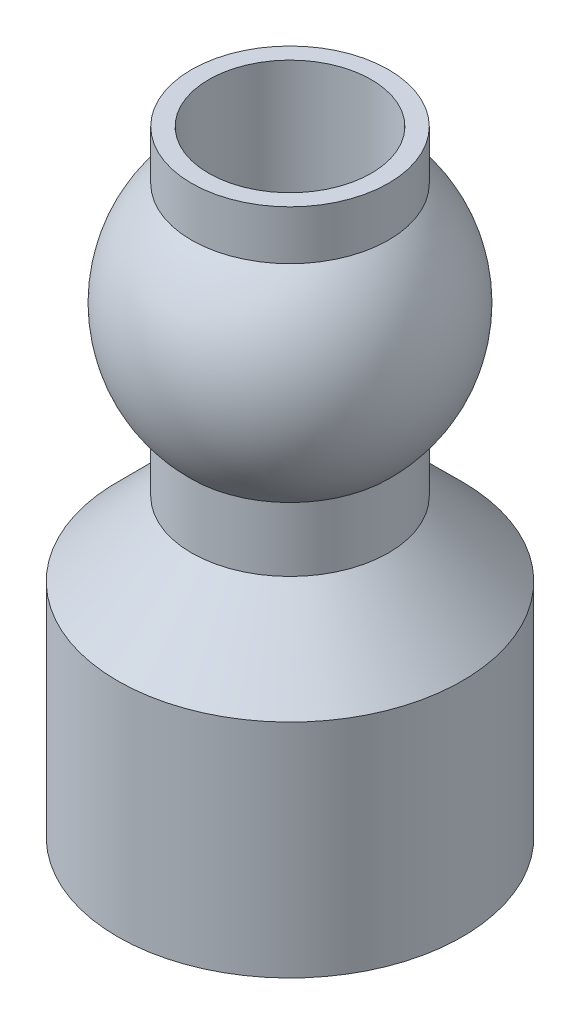
ISO-10303-21;
HEADER;
FILE_DESCRIPTION(('STEP AP214'),'2;1');
FILE_NAME('part.step','',(''),(''),'','','');
FILE_SCHEMA(('AUTOMOTIVE_DESIGN { 1 0 10303 214 1 1 1 1 }'));
ENDSEC;
DATA;
#1=APPLICATION_CONTEXT('core data for automotive mechanical design processes');
#2=APPLICATION_PROTOCOL_DEFINITION('international standard','automotive_design',2000,#1);
#3=PRODUCT_CONTEXT('',#1,'mechanical');
#4=PRODUCT('Part','Part','',(#3));
#5=PRODUCT_RELATED_PRODUCT_CATEGORY('part','',(#4));
#6=PRODUCT_DEFINITION_FORMATION('','',#4);
#7=PRODUCT_DEFINITION_CONTEXT('part definition',#1,'design');
#8=PRODUCT_DEFINITION('design','',#6,#7);
#9=PRODUCT_DEFINITION_SHAPE('','',#8);
#10=(LENGTH_UNIT() NAMED_UNIT(*) SI_UNIT(.MILLI.,.METRE.));
#11=(NAMED_UNIT(*) PLANE_ANGLE_UNIT() SI_UNIT($,.RADIAN.));
#12=(NAMED_UNIT(*) SI_UNIT($,.STERADIAN.) SOLID_ANGLE_UNIT());
#13=UNCERTAINTY_MEASURE_WITH_UNIT(LENGTH_MEASURE(1.E-05),#10,'distance_accuracy_value','');
#14=(GEOMETRIC_REPRESENTATION_CONTEXT(3) GLOBAL_UNCERTAINTY_ASSIGNED_CONTEXT((#13)) GLOBAL_UNIT_ASSIGNED_CONTEXT((#10,
#11,#12)) REPRESENTATION_CONTEXT('',''));
#15=CARTESIAN_POINT('',(0.,0.,0.));
#16=DIRECTION('',(0.,0.,1.));
#17=DIRECTION('',(1.,0.,0.));
#18=AXIS2_PLACEMENT_3D('',#15,#16,#17);
#19=CARTESIAN_POINT('',(2.,6.25,0.));
#20=DIRECTION('',(0.,-1.,0.));
#21=DIRECTION('',(0.,0.,-1.));
#22=AXIS2_PLACEMENT_3D('',#19,#20,#21);
#23=PLANE('',#22);
#24=CARTESIAN_POINT('',(0.,6.25,0.));
#25=DIRECTION('',(0.,1.,0.));
#26=DIRECTION('',(0.,0.,1.));
#27=AXIS2_PLACEMENT_3D('',#24,#25,#26);
#28=CIRCLE('',#27,1.65);
#29=CARTESIAN_POINT('',(0.,6.25,1.65));
#30=VERTEX_POINT('',#29);
#31=EDGE_CURVE('E59',#30,#30,#28,.T.);
#32=ORIENTED_EDGE('',*,*,#31,.F.);
#33=EDGE_LOOP('',(#32));
#34=FACE_BOUND('',#33,.T.);
#35=CARTESIAN_POINT('',(0.,6.25,0.));
#36=DIRECTION('',(0.,1.,0.));
#37=DIRECTION('',(0.,0.,1.));
#38=AXIS2_PLACEMENT_3D('',#35,#36,#37);
#39=CIRCLE('',#38,2.);
#40=CARTESIAN_POINT('',(0.,6.25,2.));
#41=VERTEX_POINT('',#40);
#42=EDGE_CURVE('E10',#41,#41,#39,.T.);
#43=ORIENTED_EDGE('',*,*,#42,.T.);
#44=EDGE_LOOP('',(#43));
#45=FACE_BOUND('',#44,.T.);
#46=ADVANCED_FACE('F33',(#34,#45),#23,.F.);
#47=CARTESIAN_POINT('',(0.,9.81662984616882,0.));
#48=DIRECTION('',(0.,1.,0.));
#49=DIRECTION('',(0.,0.,1.));
#50=AXIS2_PLACEMENT_3D('',#47,#48,#49);
#51=CYLINDRICAL_SURFACE('',#50,2.);
#52=ORIENTED_EDGE('',*,*,#42,.F.);
#53=EDGE_LOOP('',(#52));
#54=FACE_BOUND('',#53,.T.);
#55=CARTESIAN_POINT('',(0.,5.25,0.));
#56=DIRECTION('',(0.,1.,0.));
#57=DIRECTION('',(0.,0.,1.));
#58=AXIS2_PLACEMENT_3D('',#55,#56,#57);
#59=CIRCLE('',#58,2.);
#60=CARTESIAN_POINT('',(2.,5.25,0.));
#61=VERTEX_POINT('',#60);
#62=EDGE_CURVE('E39',#61,#61,#59,.T.);
#63=ORIENTED_EDGE('',*,*,#62,.T.);
#64=EDGE_LOOP('',(#63));
#65=FACE_BOUND('',#64,.T.);
#66=ADVANCED_FACE('F75',(#54,#65),#51,.T.);
#67=CARTESIAN_POINT('',(0.,3.15,0.));
#68=DIRECTION('',(0.,1.,0.));
#69=DIRECTION('',(1.,0.,0.));
#70=AXIS2_PLACEMENT_3D('',#67,#68,#69);
#71=SPHERICAL_SURFACE('',#70,2.9);
#72=CARTESIAN_POINT('',(0.,1.05,0.));
#73=DIRECTION('',(0.,1.,0.));
#74=DIRECTION('',(0.,0.,1.));
#75=AXIS2_PLACEMENT_3D('',#72,#73,#74);
#76=CIRCLE('',#75,2.);
#77=CARTESIAN_POINT('',(2.,1.04999999999999,0.));
#78=VERTEX_POINT('',#77);
#79=EDGE_CURVE('E43',#78,#78,#76,.T.);
#80=CARTESIAN_POINT('',(2.,5.25,0.));
#81=CARTESIAN_POINT('',(2.03542885615934,5.2162598029557,0.));
#82=CARTESIAN_POINT('',(2.070002258697,5.18162152430929,0.));
#83=CARTESIAN_POINT('',(2.13735324208609,5.11064095328789,0.));
#84=CARTESIAN_POINT('',(2.17013082293753,5.07429866091289,0.));
#85=CARTESIAN_POINT('',(2.23380524851134,5.00000221190998,0.));
#86=CARTESIAN_POINT('',(2.26470209323371,4.96204805528205,0.));
#87=CARTESIAN_POINT('',(2.32453618093648,4.88462532450518,0.));
#88=CARTESIAN_POINT('',(2.35347342391688,4.84515675035623,0.));
#89=CARTESIAN_POINT('',(2.40931413081567,4.7648061963374,0.));
#90=CARTESIAN_POINT('',(2.43621759473406,4.72392421646751,0.));
#91=CARTESIAN_POINT('',(2.48792186312119,4.64085156645577,0.));
#92=CARTESIAN_POINT('',(2.51272266758993,4.59866089631391,0.));
#93=CARTESIAN_POINT('',(2.56015809784022,4.5130789102345,0.));
#94=CARTESIAN_POINT('',(2.58279272362177,4.46968759429694,0.));
#95=CARTESIAN_POINT('',(2.62583783114081,4.38181544195321,0.));
#96=CARTESIAN_POINT('',(2.6462483128783,4.33733460554702,0.));
#97=CARTESIAN_POINT('',(2.68479286122644,4.24739732621215,0.));
#98=CARTESIAN_POINT('',(2.70292692783708,4.20194088328346,0.));
#99=CARTESIAN_POINT('',(2.73687220514585,4.11016880378588,0.));
#100=CARTESIAN_POINT('',(2.75268341584398,4.06385316721699,0.));
#101=CARTESIAN_POINT('',(2.78194248919463,3.97048131357834,0.));
#102=CARTESIAN_POINT('',(2.79539035184714,3.92342509650859,0.));
#103=CARTESIAN_POINT('',(2.81988828948024,3.8286925916464,0.));
#104=CARTESIAN_POINT('',(2.83093836446082,3.78101630385396,0.));
#105=CARTESIAN_POINT('',(2.85061242778805,3.68516575530158,0.));
#106=CARTESIAN_POINT('',(2.85923641613469,3.63699149454162,0.));
#107=CARTESIAN_POINT('',(2.87403622038034,3.54026837310766,0.));
#108=CARTESIAN_POINT('',(2.88021203627936,3.49171951243365,0.));
#109=CARTESIAN_POINT('',(2.89009967952264,3.39437152356526,0.));
#110=CARTESIAN_POINT('',(2.89381150686691,3.34557239537088,0.));
#111=CARTESIAN_POINT('',(2.89876166710559,3.24784884478433,0.));
#112=CARTESIAN_POINT('',(2.9,3.19892442239216,0.));
#113=CARTESIAN_POINT('',(2.9,3.10107557760783,0.));
#114=CARTESIAN_POINT('',(2.89876166710559,3.05215115521566,0.));
#115=CARTESIAN_POINT('',(2.89381150686691,2.95442760462911,0.));
#116=CARTESIAN_POINT('',(2.89009967952264,2.90562847643473,0.));
#117=CARTESIAN_POINT('',(2.88021203627936,2.80828048756634,0.));
#118=CARTESIAN_POINT('',(2.87403622038034,2.75973162689233,0.));
#119=CARTESIAN_POINT('',(2.85923641613469,2.66300850545837,0.));
#120=CARTESIAN_POINT('',(2.85061242778805,2.61483424469842,0.));
#121=CARTESIAN_POINT('',(2.83093836446082,2.51898369614603,0.));
#122=CARTESIAN_POINT('',(2.81988828948024,2.4713074083536,0.));
#123=CARTESIAN_POINT('',(2.79539035184714,2.37657490349141,0.));
#124=CARTESIAN_POINT('',(2.78194248919463,2.32951868642165,0.));
#125=CARTESIAN_POINT('',(2.75268341584398,2.23614683278301,0.));
#126=CARTESIAN_POINT('',(2.73687220514585,2.18983119621411,0.));
#127=CARTESIAN_POINT('',(2.70292692783708,2.09805911671653,0.));
#128=CARTESIAN_POINT('',(2.68479286122644,2.05260267378785,0.));
#129=CARTESIAN_POINT('',(2.6462483128783,1.96266539445297,0.));
#130=CARTESIAN_POINT('',(2.62583783114081,1.91818455804679,0.));
#131=CARTESIAN_POINT('',(2.58279272362177,1.83031240570305,0.));
#132=CARTESIAN_POINT('',(2.56015809784022,1.78692108976549,0.));
#133=CARTESIAN_POINT('',(2.51272266758993,1.70133910368608,0.));
#134=CARTESIAN_POINT('',(2.48792186312119,1.65914843354423,0.));
#135=CARTESIAN_POINT('',(2.43621759473406,1.57607578353248,0.));
#136=CARTESIAN_POINT('',(2.40931413081567,1.5351938036626,0.));
#137=CARTESIAN_POINT('',(2.35347342391688,1.45484324964376,0.));
#138=CARTESIAN_POINT('',(2.32453618093648,1.41537467549482,0.));
#139=CARTESIAN_POINT('',(2.26470209323371,1.33795194471794,0.));
#140=CARTESIAN_POINT('',(2.23380524851134,1.29999778809001,0.));
#141=CARTESIAN_POINT('',(2.17013082293753,1.2257013390871,0.));
#142=CARTESIAN_POINT('',(2.13735324208609,1.18935904671211,0.));
#143=CARTESIAN_POINT('',(2.070002258697,1.11837847569071,0.));
#144=CARTESIAN_POINT('',(2.03542885615934,1.0837401970443,0.));
#145=CARTESIAN_POINT('',(2.,1.04999999999999,0.));
#146=B_SPLINE_CURVE_WITH_KNOTS('',3,(#80,#81,#82,#83,#84,#85,#86,#87,#88,#89,#90,#91,#92,#93,
#94,#95,#96,#97,#98,#99,#100,#101,#102,#103,#104,#105,#106,#107,#108,#109,#110,#111,#112,#113,
#114,#115,#116,#117,#118,#119,#120,#121,#122,#123,#124,#125,#126,#127,#128,#129,#130,#131,#132,
#133,#134,#135,#136,#137,#138,#139,#140,#141,#142,#143,#144,#145),.UNSPECIFIED.,.F.,.F.,(4,2,2,
2,2,2,2,2,2,2,2,2,2,2,2,2,2,2,2,2,2,2,2,2,2,2,2,2,2,2,2,2,4),(0.,0.146757607911029,
0.293515215822059,0.440272823733087,0.587030431644117,0.733788039555146,0.880545647466176,
1.0273032553772,1.17406086328823,1.32081847119926,1.46757607911029,1.61433368702132,
1.76109129493235,1.90784890284338,2.05460651075441,2.20136411866544,2.34812172657647,
2.4948793344875,2.64163694239853,2.78839455030956,2.93515215822059,3.08190976613161,
3.22866737404264,3.37542498195367,3.5221825898647,3.66894019777573,3.81569780568676,
3.96245541359779,4.10921302150882,4.25597062941985,4.40272823733088,4.54948584524191,
4.69624345315294),.UNSPECIFIED.);
#147=EDGE_CURVE('BSEAM79',#61,#78,#146,.T.);
#148=ORIENTED_EDGE('',*,*,#62,.F.);
#149=ORIENTED_EDGE('',*,*,#79,.T.);
#150=ORIENTED_EDGE('',*,*,#147,.T.);
#151=ORIENTED_EDGE('',*,*,#147,.F.);
#152=EDGE_LOOP('',(#148,#150,#149,#151));
#153=FACE_BOUND('',#152,.T.);
#154=ADVANCED_FACE('F79',(#153),#71,.T.);
#155=CARTESIAN_POINT('',(0.,9.81662984616882,0.));
#156=DIRECTION('',(0.,1.,0.));
#157=DIRECTION('',(0.,0.,1.));
#158=AXIS2_PLACEMENT_3D('',#155,#156,#157);
#159=CYLINDRICAL_SURFACE('',#158,2.);
#160=ORIENTED_EDGE('',*,*,#79,.F.);
#161=EDGE_LOOP('',(#160));
#162=FACE_BOUND('',#161,.T.);
#163=CARTESIAN_POINT('',(0.,-0.25,0.));
#164=DIRECTION('',(0.,1.,0.));
#165=DIRECTION('',(0.,0.,1.));
#166=AXIS2_PLACEMENT_3D('',#163,#164,#165);
#167=CIRCLE('',#166,2.);
#168=CARTESIAN_POINT('',(0.,-0.25,2.));
#169=VERTEX_POINT('',#168);
#170=EDGE_CURVE('E47',#169,#169,#167,.T.);
#171=ORIENTED_EDGE('',*,*,#170,.T.);
#172=EDGE_LOOP('',(#171));
#173=FACE_BOUND('',#172,.T.);
#174=ADVANCED_FACE('F84',(#162,#173),#159,.T.);
#175=CARTESIAN_POINT('',(0.,-1.75,0.));
#176=DIRECTION('',(0.,-1.,0.));
#177=DIRECTION('',(0.,0.,-1.));
#178=AXIS2_PLACEMENT_3D('',#175,#176,#177);
#179=CONICAL_SURFACE('',#178,3.5,0.785398163397449);
#180=ORIENTED_EDGE('',*,*,#170,.F.);
#181=EDGE_LOOP('',(#180));
#182=FACE_BOUND('',#181,.T.);
#183=CARTESIAN_POINT('',(0.,-1.75,0.));
#184=DIRECTION('',(0.,1.,0.));
#185=DIRECTION('',(0.,0.,1.));
#186=AXIS2_PLACEMENT_3D('',#183,#184,#185);
#187=CIRCLE('',#186,3.5);
#188=CARTESIAN_POINT('',(0.,-1.75,3.5));
#189=VERTEX_POINT('',#188);
#190=EDGE_CURVE('E52',#189,#189,#187,.T.);
#191=ORIENTED_EDGE('',*,*,#190,.T.);
#192=EDGE_LOOP('',(#191));
#193=FACE_BOUND('',#192,.T.);
#194=ADVANCED_FACE('F90',(#182,#193),#179,.T.);
#195=CARTESIAN_POINT('',(0.,9.81662984616882,0.));
#196=DIRECTION('',(0.,1.,0.));
#197=DIRECTION('',(0.,0.,1.));
#198=AXIS2_PLACEMENT_3D('',#195,#196,#197);
#199=CYLINDRICAL_SURFACE('',#198,3.5);
#200=ORIENTED_EDGE('',*,*,#190,.F.);
#201=EDGE_LOOP('',(#200));
#202=FACE_BOUND('',#201,.T.);
#203=CARTESIAN_POINT('',(0.,-6.25,0.));
#204=DIRECTION('',(0.,1.,0.));
#205=DIRECTION('',(0.,0.,1.));
#206=AXIS2_PLACEMENT_3D('',#203,#204,#205);
#207=CIRCLE('',#206,3.5);
#208=CARTESIAN_POINT('',(0.,-6.25,3.5));
#209=VERTEX_POINT('',#208);
#210=EDGE_CURVE('E55',#209,#209,#207,.T.);
#211=ORIENTED_EDGE('',*,*,#210,.T.);
#212=EDGE_LOOP('',(#211));
#213=FACE_BOUND('',#212,.T.);
#214=ADVANCED_FACE('F94',(#202,#213),#199,.T.);
#215=CARTESIAN_POINT('',(0.,-6.25,0.));
#216=DIRECTION('',(0.,1.,0.));
#217=DIRECTION('',(0.,0.,1.));
#218=AXIS2_PLACEMENT_3D('',#215,#216,#217);
#219=PLANE('',#218);
#220=CARTESIAN_POINT('',(0.,-6.25,0.));
#221=DIRECTION('',(0.,1.,0.));
#222=DIRECTION('',(0.,0.,1.));
#223=AXIS2_PLACEMENT_3D('',#220,#221,#222);
#224=CIRCLE('',#223,1.65);
#225=CARTESIAN_POINT('',(0.,-6.25,1.65));
#226=VERTEX_POINT('',#225);
#227=EDGE_CURVE('E58',#226,#226,#224,.T.);
#228=ORIENTED_EDGE('',*,*,#227,.T.);
#229=EDGE_LOOP('',(#228));
#230=FACE_BOUND('',#229,.T.);
#231=ORIENTED_EDGE('',*,*,#210,.F.);
#232=EDGE_LOOP('',(#231));
#233=FACE_BOUND('',#232,.T.);
#234=ADVANCED_FACE('F65',(#230,#233),#219,.F.);
#235=CARTESIAN_POINT('',(0.,-6.25,0.));
#236=DIRECTION('',(0.,1.,0.));
#237=DIRECTION('',(0.,0.,1.));
#238=AXIS2_PLACEMENT_3D('',#235,#236,#237);
#239=CYLINDRICAL_SURFACE('',#238,1.65);
#240=ORIENTED_EDGE('',*,*,#227,.F.);
#241=EDGE_LOOP('',(#240));
#242=FACE_BOUND('',#241,.T.);
#243=ORIENTED_EDGE('',*,*,#31,.T.);
#244=EDGE_LOOP('',(#243));
#245=FACE_BOUND('',#244,.T.);
#246=ADVANCED_FACE('F68',(#242,#245),#239,.F.);
#247=CLOSED_SHELL('',(#46,#66,#154,#174,#194,#214,#234,#246));
#248=MANIFOLD_SOLID_BREP('B2',#247);
#249=ADVANCED_BREP_SHAPE_REPRESENTATION('',(#18,#248),#14);
#250=SHAPE_DEFINITION_REPRESENTATION(#9,#249);
ENDSEC;
END-ISO-10303-21;
